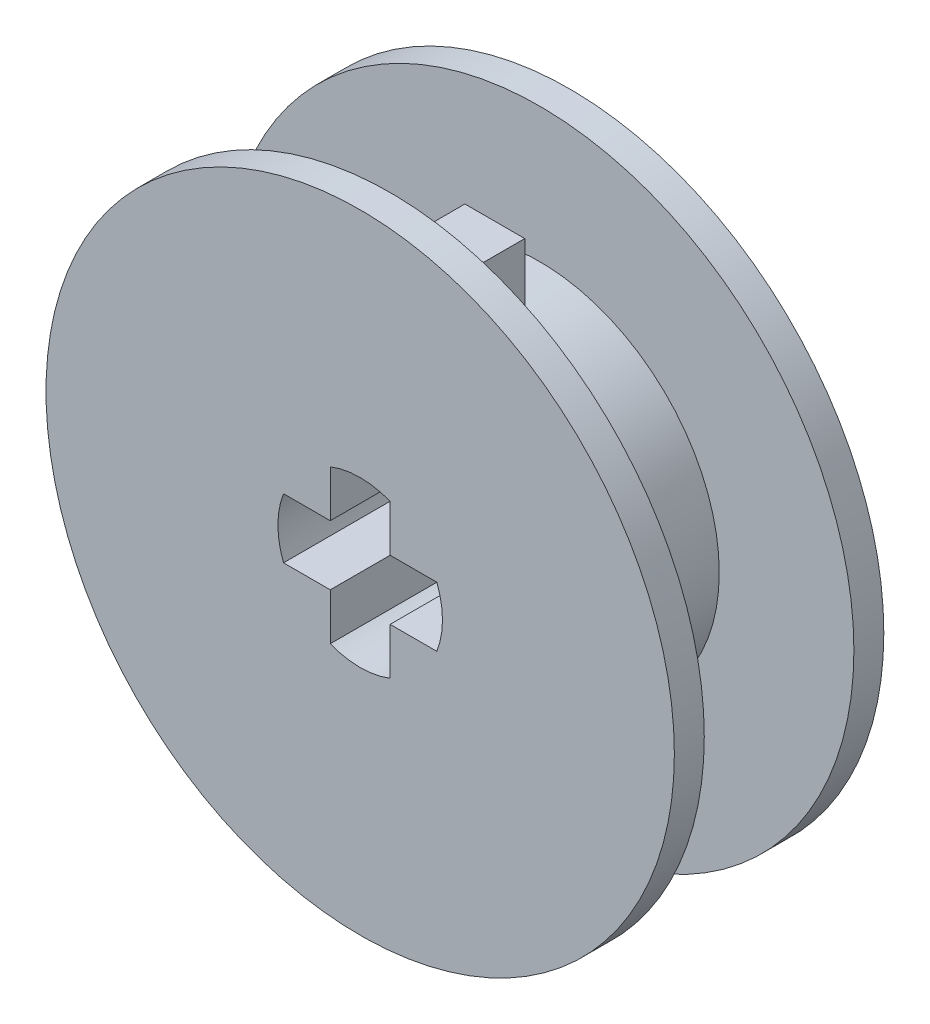
ISO-10303-21;
HEADER;
FILE_DESCRIPTION(('STEP AP214'),'2;1');
FILE_NAME('part.step','',(''),(''),'','','');
FILE_SCHEMA(('AUTOMOTIVE_DESIGN { 1 0 10303 214 1 1 1 1 }'));
ENDSEC;
DATA;
#1=APPLICATION_CONTEXT('core data for automotive mechanical design processes');
#2=APPLICATION_PROTOCOL_DEFINITION('international standard','automotive_design',2000,#1);
#3=PRODUCT_CONTEXT('',#1,'mechanical');
#4=PRODUCT('Part','Part','',(#3));
#5=PRODUCT_RELATED_PRODUCT_CATEGORY('part','',(#4));
#6=PRODUCT_DEFINITION_FORMATION('','',#4);
#7=PRODUCT_DEFINITION_CONTEXT('part definition',#1,'design');
#8=PRODUCT_DEFINITION('design','',#6,#7);
#9=PRODUCT_DEFINITION_SHAPE('','',#8);
#10=(LENGTH_UNIT() NAMED_UNIT(*) SI_UNIT(.MILLI.,.METRE.));
#11=(NAMED_UNIT(*) PLANE_ANGLE_UNIT() SI_UNIT($,.RADIAN.));
#12=(NAMED_UNIT(*) SI_UNIT($,.STERADIAN.) SOLID_ANGLE_UNIT());
#13=UNCERTAINTY_MEASURE_WITH_UNIT(LENGTH_MEASURE(1.E-05),#10,'distance_accuracy_value','');
#14=(GEOMETRIC_REPRESENTATION_CONTEXT(3) GLOBAL_UNCERTAINTY_ASSIGNED_CONTEXT((#13)) GLOBAL_UNIT_ASSIGNED_CONTEXT((#10,
#11,#12)) REPRESENTATION_CONTEXT('',''));
#15=CARTESIAN_POINT('',(0.,0.,0.));
#16=DIRECTION('',(0.,0.,1.));
#17=DIRECTION('',(1.,0.,0.));
#18=AXIS2_PLACEMENT_3D('',#15,#16,#17);
#19=CARTESIAN_POINT('',(0.,0.,2.5));
#20=DIRECTION('',(0.,0.,-1.));
#21=DIRECTION('',(-1.,0.,0.));
#22=AXIS2_PLACEMENT_3D('',#19,#20,#21);
#23=CYLINDRICAL_SURFACE('',#22,6.);
#24=CARTESIAN_POINT('',(0.,0.,2.5));
#25=DIRECTION('',(0.,0.,1.));
#26=DIRECTION('',(1.,0.,0.));
#27=AXIS2_PLACEMENT_3D('',#24,#25,#26);
#28=CIRCLE('',#27,6.);
#29=CARTESIAN_POINT('',(6.,0.,2.5));
#30=VERTEX_POINT('',#29);
#31=EDGE_CURVE('E42',#30,#30,#28,.T.);
#32=ORIENTED_EDGE('',*,*,#31,.F.);
#33=EDGE_LOOP('',(#32));
#34=FACE_BOUND('',#33,.T.);
#35=CARTESIAN_POINT('',(0.,0.,1.));
#36=DIRECTION('',(0.,0.,1.));
#37=DIRECTION('',(1.,0.,0.));
#38=AXIS2_PLACEMENT_3D('',#35,#36,#37);
#39=CIRCLE('',#38,6.);
#40=CARTESIAN_POINT('',(1.,5.91607978309962,1.));
#41=VERTEX_POINT('',#40);
#42=CARTESIAN_POINT('',(-0.999999999999999,5.91607978309962,1.));
#43=VERTEX_POINT('',#42);
#44=EDGE_CURVE('E11',#41,#43,#39,.T.);
#45=ORIENTED_EDGE('',*,*,#44,.T.);
#46=DIRECTION('',(0.,0.,-1.));
#47=VECTOR('',#46,1.);
#48=CARTESIAN_POINT('',(-0.999999999999999,5.91607978309962,1.));
#49=LINE('',#48,#47);
#50=CARTESIAN_POINT('',(-0.999999999999999,5.91607978309962,-1.));
#51=VERTEX_POINT('',#50);
#52=EDGE_CURVE('E155',#43,#51,#49,.T.);
#53=ORIENTED_EDGE('',*,*,#52,.T.);
#54=CARTESIAN_POINT('',(0.,0.,-1.));
#55=DIRECTION('',(0.,0.,1.));
#56=DIRECTION('',(1.,0.,0.));
#57=AXIS2_PLACEMENT_3D('',#54,#55,#56);
#58=CIRCLE('',#57,6.);
#59=CARTESIAN_POINT('',(1.,5.91607978309962,-1.));
#60=VERTEX_POINT('',#59);
#61=EDGE_CURVE('E163',#60,#51,#58,.T.);
#62=ORIENTED_EDGE('',*,*,#61,.F.);
#63=DIRECTION('',(0.,0.,-1.));
#64=VECTOR('',#63,1.);
#65=CARTESIAN_POINT('',(1.,5.91607978309962,1.));
#66=LINE('',#65,#64);
#67=EDGE_CURVE('E52',#41,#60,#66,.T.);
#68=ORIENTED_EDGE('',*,*,#67,.F.);
#69=EDGE_LOOP('',(#45,#53,#62,#68));
#70=FACE_BOUND('',#69,.T.);
#71=CARTESIAN_POINT('',(0.,0.,-2.5));
#72=DIRECTION('',(0.,0.,1.));
#73=DIRECTION('',(1.,0.,0.));
#74=AXIS2_PLACEMENT_3D('',#71,#72,#73);
#75=CIRCLE('',#74,6.);
#76=CARTESIAN_POINT('',(6.,0.,-2.5));
#77=VERTEX_POINT('',#76);
#78=EDGE_CURVE('E210',#77,#77,#75,.T.);
#79=ORIENTED_EDGE('',*,*,#78,.T.);
#80=EDGE_LOOP('',(#79));
#81=FACE_BOUND('',#80,.T.);
#82=ADVANCED_FACE('F35',(#34,#70,#81),#23,.T.);
#83=CARTESIAN_POINT('',(0.,0.,2.5));
#84=DIRECTION('',(0.,0.,-1.));
#85=DIRECTION('',(-1.,0.,0.));
#86=AXIS2_PLACEMENT_3D('',#83,#84,#85);
#87=CYLINDRICAL_SURFACE('',#86,2.75);
#88=DIRECTION('',(0.,0.,-1.));
#89=VECTOR('',#88,1.);
#90=CARTESIAN_POINT('',(2.5617376914899,1.,2.5));
#91=LINE('',#90,#89);
#92=CARTESIAN_POINT('',(2.5617376914899,1.,3.5));
#93=VERTEX_POINT('',#92);
#94=CARTESIAN_POINT('',(2.5617376914899,1.,-3.5));
#95=VERTEX_POINT('',#94);
#96=EDGE_CURVE('E289',#93,#95,#91,.T.);
#97=ORIENTED_EDGE('',*,*,#96,.T.);
#98=CARTESIAN_POINT('',(0.,0.,-3.5));
#99=DIRECTION('',(0.,0.,1.));
#100=DIRECTION('',(1.,0.,0.));
#101=AXIS2_PLACEMENT_3D('',#98,#99,#100);
#102=CIRCLE('',#101,2.75);
#103=CARTESIAN_POINT('',(2.5617376914899,-1.,-3.5));
#104=VERTEX_POINT('',#103);
#105=EDGE_CURVE('E197',#104,#95,#102,.T.);
#106=ORIENTED_EDGE('',*,*,#105,.F.);
#107=DIRECTION('',(0.,0.,-1.));
#108=VECTOR('',#107,1.);
#109=CARTESIAN_POINT('',(2.5617376914899,-1.,2.5));
#110=LINE('',#109,#108);
#111=CARTESIAN_POINT('',(2.5617376914899,-1.,3.5));
#112=VERTEX_POINT('',#111);
#113=EDGE_CURVE('E265',#112,#104,#110,.T.);
#114=ORIENTED_EDGE('',*,*,#113,.F.);
#115=CARTESIAN_POINT('',(0.,0.,3.5));
#116=DIRECTION('',(0.,0.,1.));
#117=DIRECTION('',(1.,0.,0.));
#118=AXIS2_PLACEMENT_3D('',#115,#116,#117);
#119=CIRCLE('',#118,2.75);
#120=EDGE_CURVE('E252',#112,#93,#119,.T.);
#121=ORIENTED_EDGE('',*,*,#120,.T.);
#122=EDGE_LOOP('',(#97,#106,#114,#121));
#123=FACE_BOUND('',#122,.T.);
#124=ADVANCED_FACE('F296',(#123),#87,.F.);
#125=CARTESIAN_POINT('',(1.,1.,2.5));
#126=DIRECTION('',(0.,-1.,0.));
#127=DIRECTION('',(1.,0.,0.));
#128=AXIS2_PLACEMENT_3D('',#125,#126,#127);
#129=PLANE('',#128);
#130=DIRECTION('',(0.,0.,-1.));
#131=VECTOR('',#130,1.);
#132=CARTESIAN_POINT('',(1.,1.,2.5));
#133=LINE('',#132,#131);
#134=CARTESIAN_POINT('',(1.,0.999999999999999,3.5));
#135=VERTEX_POINT('',#134);
#136=CARTESIAN_POINT('',(1.,0.999999999999999,-3.5));
#137=VERTEX_POINT('',#136);
#138=EDGE_CURVE('E287',#135,#137,#133,.T.);
#139=ORIENTED_EDGE('',*,*,#138,.T.);
#140=DIRECTION('',(-1.,0.,0.));
#141=VECTOR('',#140,1.);
#142=CARTESIAN_POINT('',(2.5617376914899,1.,-3.5));
#143=LINE('',#142,#141);
#144=EDGE_CURVE('E200',#95,#137,#143,.T.);
#145=ORIENTED_EDGE('',*,*,#144,.F.);
#146=ORIENTED_EDGE('',*,*,#96,.F.);
#147=DIRECTION('',(-1.,0.,0.));
#148=VECTOR('',#147,1.);
#149=CARTESIAN_POINT('',(2.5617376914899,1.,3.5));
#150=LINE('',#149,#148);
#151=EDGE_CURVE('E255',#93,#135,#150,.T.);
#152=ORIENTED_EDGE('',*,*,#151,.T.);
#153=EDGE_LOOP('',(#139,#145,#146,#152));
#154=FACE_BOUND('',#153,.T.);
#155=ADVANCED_FACE('F378',(#154),#129,.T.);
#156=CARTESIAN_POINT('',(1.,2.5617376914899,2.5));
#157=DIRECTION('',(-1.,0.,0.));
#158=DIRECTION('',(0.,-1.,0.));
#159=AXIS2_PLACEMENT_3D('',#156,#157,#158);
#160=PLANE('',#159);
#161=DIRECTION('',(0.,0.,-1.));
#162=VECTOR('',#161,1.);
#163=CARTESIAN_POINT('',(1.,2.5617376914899,2.5));
#164=LINE('',#163,#162);
#165=CARTESIAN_POINT('',(1.,2.5617376914899,3.5));
#166=VERTEX_POINT('',#165);
#167=CARTESIAN_POINT('',(1.,2.5617376914899,-3.5));
#168=VERTEX_POINT('',#167);
#169=EDGE_CURVE('E285',#166,#168,#164,.T.);
#170=ORIENTED_EDGE('',*,*,#169,.T.);
#171=DIRECTION('',(0.,1.,0.));
#172=VECTOR('',#171,1.);
#173=CARTESIAN_POINT('',(1.,0.999999999999999,-3.5));
#174=LINE('',#173,#172);
#175=EDGE_CURVE('E203',#137,#168,#174,.T.);
#176=ORIENTED_EDGE('',*,*,#175,.F.);
#177=ORIENTED_EDGE('',*,*,#138,.F.);
#178=DIRECTION('',(0.,1.,0.));
#179=VECTOR('',#178,1.);
#180=CARTESIAN_POINT('',(1.,0.999999999999999,3.5));
#181=LINE('',#180,#179);
#182=EDGE_CURVE('E258',#135,#166,#181,.T.);
#183=ORIENTED_EDGE('',*,*,#182,.T.);
#184=EDGE_LOOP('',(#170,#176,#177,#183));
#185=FACE_BOUND('',#184,.T.);
#186=ADVANCED_FACE('F374',(#185),#160,.T.);
#187=CARTESIAN_POINT('',(0.,0.,2.5));
#188=DIRECTION('',(0.,0.,-1.));
#189=DIRECTION('',(-1.,0.,0.));
#190=AXIS2_PLACEMENT_3D('',#187,#188,#189);
#191=CYLINDRICAL_SURFACE('',#190,2.75);
#192=DIRECTION('',(0.,0.,-1.));
#193=VECTOR('',#192,1.);
#194=CARTESIAN_POINT('',(-0.999999999999999,2.5617376914899,2.5));
#195=LINE('',#194,#193);
#196=CARTESIAN_POINT('',(-0.999999999999999,2.5617376914899,3.5));
#197=VERTEX_POINT('',#196);
#198=CARTESIAN_POINT('',(-0.999999999999999,2.5617376914899,-3.5));
#199=VERTEX_POINT('',#198);
#200=EDGE_CURVE('E283',#197,#199,#195,.T.);
#201=ORIENTED_EDGE('',*,*,#200,.T.);
#202=CARTESIAN_POINT('',(0.,0.,-3.5));
#203=DIRECTION('',(0.,0.,1.));
#204=DIRECTION('',(1.,0.,0.));
#205=AXIS2_PLACEMENT_3D('',#202,#203,#204);
#206=CIRCLE('',#205,2.75);
#207=EDGE_CURVE('E167',#168,#199,#206,.T.);
#208=ORIENTED_EDGE('',*,*,#207,.F.);
#209=ORIENTED_EDGE('',*,*,#169,.F.);
#210=CARTESIAN_POINT('',(0.,0.,3.5));
#211=DIRECTION('',(0.,0.,1.));
#212=DIRECTION('',(1.,0.,0.));
#213=AXIS2_PLACEMENT_3D('',#210,#211,#212);
#214=CIRCLE('',#213,2.75);
#215=EDGE_CURVE('E222',#166,#197,#214,.T.);
#216=ORIENTED_EDGE('',*,*,#215,.T.);
#217=EDGE_LOOP('',(#201,#208,#209,#216));
#218=FACE_BOUND('',#217,.T.);
#219=ADVANCED_FACE('F370',(#218),#191,.F.);
#220=CARTESIAN_POINT('',(-1.,2.5617376914899,2.5));
#221=DIRECTION('',(1.,0.,0.));
#222=DIRECTION('',(0.,1.,0.));
#223=AXIS2_PLACEMENT_3D('',#220,#221,#222);
#224=PLANE('',#223);
#225=DIRECTION('',(0.,0.,-1.));
#226=VECTOR('',#225,1.);
#227=CARTESIAN_POINT('',(-0.999999999999999,1.,2.5));
#228=LINE('',#227,#226);
#229=CARTESIAN_POINT('',(-0.999999999999999,1.,3.5));
#230=VERTEX_POINT('',#229);
#231=CARTESIAN_POINT('',(-0.999999999999999,1.,-3.5));
#232=VERTEX_POINT('',#231);
#233=EDGE_CURVE('E281',#230,#232,#228,.T.);
#234=ORIENTED_EDGE('',*,*,#233,.T.);
#235=DIRECTION('',(0.,-1.,0.));
#236=VECTOR('',#235,1.);
#237=CARTESIAN_POINT('',(-0.999999999999999,2.5617376914899,-3.5));
#238=LINE('',#237,#236);
#239=EDGE_CURVE('E170',#199,#232,#238,.T.);
#240=ORIENTED_EDGE('',*,*,#239,.F.);
#241=ORIENTED_EDGE('',*,*,#200,.F.);
#242=DIRECTION('',(0.,-1.,0.));
#243=VECTOR('',#242,1.);
#244=CARTESIAN_POINT('',(-0.999999999999999,2.5617376914899,3.5));
#245=LINE('',#244,#243);
#246=EDGE_CURVE('E228',#197,#230,#245,.T.);
#247=ORIENTED_EDGE('',*,*,#246,.T.);
#248=EDGE_LOOP('',(#234,#240,#241,#247));
#249=FACE_BOUND('',#248,.T.);
#250=ADVANCED_FACE('F366',(#249),#224,.T.);
#251=CARTESIAN_POINT('',(-2.5617376914899,1.,2.5));
#252=DIRECTION('',(0.,-1.,0.));
#253=DIRECTION('',(1.,0.,0.));
#254=AXIS2_PLACEMENT_3D('',#251,#252,#253);
#255=PLANE('',#254);
#256=DIRECTION('',(0.,0.,-1.));
#257=VECTOR('',#256,1.);
#258=CARTESIAN_POINT('',(-2.5617376914899,1.,2.5));
#259=LINE('',#258,#257);
#260=CARTESIAN_POINT('',(-2.5617376914899,1.,3.5));
#261=VERTEX_POINT('',#260);
#262=CARTESIAN_POINT('',(-2.5617376914899,1.,-3.5));
#263=VERTEX_POINT('',#262);
#264=EDGE_CURVE('E279',#261,#263,#259,.T.);
#265=ORIENTED_EDGE('',*,*,#264,.T.);
#266=DIRECTION('',(-1.,0.,0.));
#267=VECTOR('',#266,1.);
#268=CARTESIAN_POINT('',(-0.999999999999999,1.,-3.5));
#269=LINE('',#268,#267);
#270=EDGE_CURVE('E176',#232,#263,#269,.T.);
#271=ORIENTED_EDGE('',*,*,#270,.F.);
#272=ORIENTED_EDGE('',*,*,#233,.F.);
#273=DIRECTION('',(-1.,0.,0.));
#274=VECTOR('',#273,1.);
#275=CARTESIAN_POINT('',(-0.999999999999999,1.,3.5));
#276=LINE('',#275,#274);
#277=EDGE_CURVE('E231',#230,#261,#276,.T.);
#278=ORIENTED_EDGE('',*,*,#277,.T.);
#279=EDGE_LOOP('',(#265,#271,#272,#278));
#280=FACE_BOUND('',#279,.T.);
#281=ADVANCED_FACE('F362',(#280),#255,.T.);
#282=CARTESIAN_POINT('',(0.,0.,2.5));
#283=DIRECTION('',(0.,0.,-1.));
#284=DIRECTION('',(-1.,0.,0.));
#285=AXIS2_PLACEMENT_3D('',#282,#283,#284);
#286=CYLINDRICAL_SURFACE('',#285,2.75);
#287=DIRECTION('',(0.,0.,-1.));
#288=VECTOR('',#287,1.);
#289=CARTESIAN_POINT('',(-2.5617376914899,-1.,2.5));
#290=LINE('',#289,#288);
#291=CARTESIAN_POINT('',(-2.5617376914899,-1.,3.5));
#292=VERTEX_POINT('',#291);
#293=CARTESIAN_POINT('',(-2.5617376914899,-1.,-3.5));
#294=VERTEX_POINT('',#293);
#295=EDGE_CURVE('E277',#292,#294,#290,.T.);
#296=ORIENTED_EDGE('',*,*,#295,.T.);
#297=CARTESIAN_POINT('',(0.,0.,-3.5));
#298=DIRECTION('',(0.,0.,1.));
#299=DIRECTION('',(1.,0.,0.));
#300=AXIS2_PLACEMENT_3D('',#297,#298,#299);
#301=CIRCLE('',#300,2.75);
#302=EDGE_CURVE('E179',#263,#294,#301,.T.);
#303=ORIENTED_EDGE('',*,*,#302,.F.);
#304=ORIENTED_EDGE('',*,*,#264,.F.);
#305=CARTESIAN_POINT('',(0.,0.,3.5));
#306=DIRECTION('',(0.,0.,1.));
#307=DIRECTION('',(1.,0.,0.));
#308=AXIS2_PLACEMENT_3D('',#305,#306,#307);
#309=CIRCLE('',#308,2.75);
#310=EDGE_CURVE('E234',#261,#292,#309,.T.);
#311=ORIENTED_EDGE('',*,*,#310,.T.);
#312=EDGE_LOOP('',(#296,#303,#304,#311));
#313=FACE_BOUND('',#312,.T.);
#314=ADVANCED_FACE('F358',(#313),#286,.F.);
#315=CARTESIAN_POINT('',(-2.5617376914899,-1.,2.5));
#316=DIRECTION('',(0.,1.,0.));
#317=DIRECTION('',(-1.,0.,0.));
#318=AXIS2_PLACEMENT_3D('',#315,#316,#317);
#319=PLANE('',#318);
#320=DIRECTION('',(0.,0.,-1.));
#321=VECTOR('',#320,1.);
#322=CARTESIAN_POINT('',(-0.999999999999999,-1.,2.5));
#323=LINE('',#322,#321);
#324=CARTESIAN_POINT('',(-1.,-1.,3.5));
#325=VERTEX_POINT('',#324);
#326=CARTESIAN_POINT('',(-1.,-1.,-3.5));
#327=VERTEX_POINT('',#326);
#328=EDGE_CURVE('E275',#325,#327,#323,.T.);
#329=ORIENTED_EDGE('',*,*,#328,.T.);
#330=DIRECTION('',(1.,0.,0.));
#331=VECTOR('',#330,1.);
#332=CARTESIAN_POINT('',(-2.5617376914899,-1.,-3.5));
#333=LINE('',#332,#331);
#334=EDGE_CURVE('E182',#294,#327,#333,.T.);
#335=ORIENTED_EDGE('',*,*,#334,.F.);
#336=ORIENTED_EDGE('',*,*,#295,.F.);
#337=DIRECTION('',(1.,0.,0.));
#338=VECTOR('',#337,1.);
#339=CARTESIAN_POINT('',(-2.5617376914899,-1.,3.5));
#340=LINE('',#339,#338);
#341=EDGE_CURVE('E237',#292,#325,#340,.T.);
#342=ORIENTED_EDGE('',*,*,#341,.T.);
#343=EDGE_LOOP('',(#329,#335,#336,#342));
#344=FACE_BOUND('',#343,.T.);
#345=ADVANCED_FACE('F354',(#344),#319,.T.);
#346=CARTESIAN_POINT('',(-0.999999999999999,-1.,2.5));
#347=DIRECTION('',(1.,0.,0.));
#348=DIRECTION('',(0.,1.,0.));
#349=AXIS2_PLACEMENT_3D('',#346,#347,#348);
#350=PLANE('',#349);
#351=DIRECTION('',(0.,0.,-1.));
#352=VECTOR('',#351,1.);
#353=CARTESIAN_POINT('',(-1.,-2.5617376914899,2.5));
#354=LINE('',#353,#352);
#355=CARTESIAN_POINT('',(-0.999999999999999,-2.5617376914899,3.5));
#356=VERTEX_POINT('',#355);
#357=CARTESIAN_POINT('',(-0.999999999999999,-2.5617376914899,-3.5));
#358=VERTEX_POINT('',#357);
#359=EDGE_CURVE('E273',#356,#358,#354,.T.);
#360=ORIENTED_EDGE('',*,*,#359,.T.);
#361=DIRECTION('',(0.,-1.,0.));
#362=VECTOR('',#361,1.);
#363=CARTESIAN_POINT('',(-1.,-1.,-3.5));
#364=LINE('',#363,#362);
#365=EDGE_CURVE('E185',#327,#358,#364,.T.);
#366=ORIENTED_EDGE('',*,*,#365,.F.);
#367=ORIENTED_EDGE('',*,*,#328,.F.);
#368=DIRECTION('',(0.,-1.,0.));
#369=VECTOR('',#368,1.);
#370=CARTESIAN_POINT('',(-1.,-1.,3.5));
#371=LINE('',#370,#369);
#372=EDGE_CURVE('E240',#325,#356,#371,.T.);
#373=ORIENTED_EDGE('',*,*,#372,.T.);
#374=EDGE_LOOP('',(#360,#366,#367,#373));
#375=FACE_BOUND('',#374,.T.);
#376=ADVANCED_FACE('F350',(#375),#350,.T.);
#377=CARTESIAN_POINT('',(0.,0.,2.5));
#378=DIRECTION('',(0.,0.,-1.));
#379=DIRECTION('',(-1.,0.,0.));
#380=AXIS2_PLACEMENT_3D('',#377,#378,#379);
#381=CYLINDRICAL_SURFACE('',#380,2.75);
#382=DIRECTION('',(0.,0.,-1.));
#383=VECTOR('',#382,1.);
#384=CARTESIAN_POINT('',(1.,-2.5617376914899,2.5));
#385=LINE('',#384,#383);
#386=CARTESIAN_POINT('',(1.,-2.5617376914899,3.5));
#387=VERTEX_POINT('',#386);
#388=CARTESIAN_POINT('',(1.,-2.5617376914899,-3.5));
#389=VERTEX_POINT('',#388);
#390=EDGE_CURVE('E271',#387,#389,#385,.T.);
#391=ORIENTED_EDGE('',*,*,#390,.T.);
#392=CARTESIAN_POINT('',(0.,0.,-3.5));
#393=DIRECTION('',(0.,0.,1.));
#394=DIRECTION('',(1.,0.,0.));
#395=AXIS2_PLACEMENT_3D('',#392,#393,#394);
#396=CIRCLE('',#395,2.75);
#397=EDGE_CURVE('E188',#358,#389,#396,.T.);
#398=ORIENTED_EDGE('',*,*,#397,.F.);
#399=ORIENTED_EDGE('',*,*,#359,.F.);
#400=CARTESIAN_POINT('',(0.,0.,3.5));
#401=DIRECTION('',(0.,0.,1.));
#402=DIRECTION('',(1.,0.,0.));
#403=AXIS2_PLACEMENT_3D('',#400,#401,#402);
#404=CIRCLE('',#403,2.75);
#405=EDGE_CURVE('E243',#356,#387,#404,.T.);
#406=ORIENTED_EDGE('',*,*,#405,.T.);
#407=EDGE_LOOP('',(#391,#398,#399,#406));
#408=FACE_BOUND('',#407,.T.);
#409=ADVANCED_FACE('F346',(#408),#381,.F.);
#410=CARTESIAN_POINT('',(1.,-1.,2.5));
#411=DIRECTION('',(-1.,0.,0.));
#412=DIRECTION('',(0.,-1.,0.));
#413=AXIS2_PLACEMENT_3D('',#410,#411,#412);
#414=PLANE('',#413);
#415=DIRECTION('',(0.,0.,-1.));
#416=VECTOR('',#415,1.);
#417=CARTESIAN_POINT('',(1.,-1.,2.5));
#418=LINE('',#417,#416);
#419=CARTESIAN_POINT('',(1.,-1.,3.5));
#420=VERTEX_POINT('',#419);
#421=CARTESIAN_POINT('',(1.,-1.,-3.5));
#422=VERTEX_POINT('',#421);
#423=EDGE_CURVE('E269',#420,#422,#418,.T.);
#424=ORIENTED_EDGE('',*,*,#423,.T.);
#425=DIRECTION('',(0.,1.,0.));
#426=VECTOR('',#425,1.);
#427=CARTESIAN_POINT('',(1.,-2.5617376914899,-3.5));
#428=LINE('',#427,#426);
#429=EDGE_CURVE('E191',#389,#422,#428,.T.);
#430=ORIENTED_EDGE('',*,*,#429,.F.);
#431=ORIENTED_EDGE('',*,*,#390,.F.);
#432=DIRECTION('',(0.,1.,0.));
#433=VECTOR('',#432,1.);
#434=CARTESIAN_POINT('',(1.,-2.5617376914899,3.5));
#435=LINE('',#434,#433);
#436=EDGE_CURVE('E246',#387,#420,#435,.T.);
#437=ORIENTED_EDGE('',*,*,#436,.T.);
#438=EDGE_LOOP('',(#424,#430,#431,#437));
#439=FACE_BOUND('',#438,.T.);
#440=ADVANCED_FACE('F342',(#439),#414,.T.);
#441=CARTESIAN_POINT('',(1.,-1.,2.5));
#442=DIRECTION('',(0.,1.,0.));
#443=DIRECTION('',(-1.,0.,0.));
#444=AXIS2_PLACEMENT_3D('',#441,#442,#443);
#445=PLANE('',#444);
#446=ORIENTED_EDGE('',*,*,#113,.T.);
#447=DIRECTION('',(1.,0.,0.));
#448=VECTOR('',#447,1.);
#449=CARTESIAN_POINT('',(1.,-1.,-3.5));
#450=LINE('',#449,#448);
#451=EDGE_CURVE('E194',#422,#104,#450,.T.);
#452=ORIENTED_EDGE('',*,*,#451,.F.);
#453=ORIENTED_EDGE('',*,*,#423,.F.);
#454=DIRECTION('',(1.,0.,0.));
#455=VECTOR('',#454,1.);
#456=CARTESIAN_POINT('',(1.,-1.,3.5));
#457=LINE('',#456,#455);
#458=EDGE_CURVE('E249',#420,#112,#457,.T.);
#459=ORIENTED_EDGE('',*,*,#458,.T.);
#460=EDGE_LOOP('',(#446,#452,#453,#459));
#461=FACE_BOUND('',#460,.T.);
#462=ADVANCED_FACE('F335',(#461),#445,.T.);
#463=CARTESIAN_POINT('',(0.,0.,2.5));
#464=DIRECTION('',(0.,0.,1.));
#465=DIRECTION('',(1.,0.,0.));
#466=AXIS2_PLACEMENT_3D('',#463,#464,#465);
#467=PLANE('',#466);
#468=CARTESIAN_POINT('',(0.,0.,2.5));
#469=DIRECTION('',(0.,0.,1.));
#470=DIRECTION('',(1.,0.,0.));
#471=AXIS2_PLACEMENT_3D('',#468,#469,#470);
#472=CIRCLE('',#471,10.5);
#473=CARTESIAN_POINT('',(10.5,0.,2.5));
#474=VERTEX_POINT('',#473);
#475=EDGE_CURVE('E261',#474,#474,#472,.T.);
#476=ORIENTED_EDGE('',*,*,#475,.F.);
#477=EDGE_LOOP('',(#476));
#478=FACE_BOUND('',#477,.T.);
#479=ORIENTED_EDGE('',*,*,#31,.T.);
#480=EDGE_LOOP('',(#479));
#481=FACE_BOUND('',#480,.T.);
#482=ADVANCED_FACE('F293',(#478,#481),#467,.F.);
#483=CARTESIAN_POINT('',(0.,0.,3.5));
#484=DIRECTION('',(0.,0.,1.));
#485=DIRECTION('',(1.,0.,0.));
#486=AXIS2_PLACEMENT_3D('',#483,#484,#485);
#487=PLANE('',#486);
#488=CARTESIAN_POINT('',(0.,0.,3.5));
#489=DIRECTION('',(0.,0.,1.));
#490=DIRECTION('',(1.,0.,0.));
#491=AXIS2_PLACEMENT_3D('',#488,#489,#490);
#492=CIRCLE('',#491,10.5);
#493=CARTESIAN_POINT('',(10.5,0.,3.5));
#494=VERTEX_POINT('',#493);
#495=EDGE_CURVE('E262',#494,#494,#492,.T.);
#496=ORIENTED_EDGE('',*,*,#495,.T.);
#497=EDGE_LOOP('',(#496));
#498=FACE_BOUND('',#497,.T.);
#499=ORIENTED_EDGE('',*,*,#246,.F.);
#500=ORIENTED_EDGE('',*,*,#215,.F.);
#501=ORIENTED_EDGE('',*,*,#182,.F.);
#502=ORIENTED_EDGE('',*,*,#151,.F.);
#503=ORIENTED_EDGE('',*,*,#120,.F.);
#504=ORIENTED_EDGE('',*,*,#458,.F.);
#505=ORIENTED_EDGE('',*,*,#436,.F.);
#506=ORIENTED_EDGE('',*,*,#405,.F.);
#507=ORIENTED_EDGE('',*,*,#372,.F.);
#508=ORIENTED_EDGE('',*,*,#341,.F.);
#509=ORIENTED_EDGE('',*,*,#310,.F.);
#510=ORIENTED_EDGE('',*,*,#277,.F.);
#511=EDGE_LOOP('',(#499,#500,#501,#502,#503,#504,#505,#506,#507,#508,#509,#510));
#512=FACE_BOUND('',#511,.T.);
#513=ADVANCED_FACE('F329',(#498,#512),#487,.T.);
#514=CARTESIAN_POINT('',(0.,0.,3.5));
#515=DIRECTION('',(0.,0.,-1.));
#516=DIRECTION('',(-1.,0.,0.));
#517=AXIS2_PLACEMENT_3D('',#514,#515,#516);
#518=CYLINDRICAL_SURFACE('',#517,10.5);
#519=ORIENTED_EDGE('',*,*,#495,.F.);
#520=EDGE_LOOP('',(#519));
#521=FACE_BOUND('',#520,.T.);
#522=ORIENTED_EDGE('',*,*,#475,.T.);
#523=EDGE_LOOP('',(#522));
#524=FACE_BOUND('',#523,.T.);
#525=ADVANCED_FACE('F327',(#521,#524),#518,.T.);
#526=CARTESIAN_POINT('',(1.,5.91607978309962,1.));
#527=DIRECTION('',(1.,0.,0.));
#528=DIRECTION('',(0.,0.,-1.));
#529=AXIS2_PLACEMENT_3D('',#526,#527,#528);
#530=PLANE('',#529);
#531=ORIENTED_EDGE('',*,*,#67,.T.);
#532=DIRECTION('',(0.,-1.,0.));
#533=VECTOR('',#532,1.);
#534=CARTESIAN_POINT('',(1.,5.91607978309962,-1.));
#535=LINE('',#534,#533);
#536=CARTESIAN_POINT('',(1.,7.91607978309962,-1.));
#537=VERTEX_POINT('',#536);
#538=EDGE_CURVE('E164',#537,#60,#535,.T.);
#539=ORIENTED_EDGE('',*,*,#538,.F.);
#540=DIRECTION('',(0.,0.,-1.));
#541=VECTOR('',#540,1.);
#542=CARTESIAN_POINT('',(1.,7.91607978309962,1.));
#543=LINE('',#542,#541);
#544=CARTESIAN_POINT('',(1.,7.91607978309962,1.));
#545=VERTEX_POINT('',#544);
#546=EDGE_CURVE('E154',#545,#537,#543,.T.);
#547=ORIENTED_EDGE('',*,*,#546,.F.);
#548=DIRECTION('',(0.,-1.,0.));
#549=VECTOR('',#548,1.);
#550=CARTESIAN_POINT('',(1.,5.91607978309962,1.));
#551=LINE('',#550,#549);
#552=EDGE_CURVE('E216',#545,#41,#551,.T.);
#553=ORIENTED_EDGE('',*,*,#552,.T.);
#554=EDGE_LOOP('',(#531,#539,#547,#553));
#555=FACE_BOUND('',#554,.T.);
#556=ADVANCED_FACE('F322',(#555),#530,.T.);
#557=CARTESIAN_POINT('',(1.,7.91607978309962,1.));
#558=DIRECTION('',(0.,1.,0.));
#559=DIRECTION('',(0.,0.,1.));
#560=AXIS2_PLACEMENT_3D('',#557,#558,#559);
#561=PLANE('',#560);
#562=ORIENTED_EDGE('',*,*,#546,.T.);
#563=DIRECTION('',(1.,0.,0.));
#564=VECTOR('',#563,1.);
#565=CARTESIAN_POINT('',(1.,7.91607978309962,-1.));
#566=LINE('',#565,#564);
#567=CARTESIAN_POINT('',(-0.999999999999999,7.91607978309962,-1.));
#568=VERTEX_POINT('',#567);
#569=EDGE_CURVE('E161',#568,#537,#566,.T.);
#570=ORIENTED_EDGE('',*,*,#569,.F.);
#571=DIRECTION('',(0.,0.,-1.));
#572=VECTOR('',#571,1.);
#573=CARTESIAN_POINT('',(-0.999999999999999,7.91607978309962,1.));
#574=LINE('',#573,#572);
#575=CARTESIAN_POINT('',(-0.999999999999999,7.91607978309962,1.));
#576=VERTEX_POINT('',#575);
#577=EDGE_CURVE('E143',#576,#568,#574,.T.);
#578=ORIENTED_EDGE('',*,*,#577,.F.);
#579=DIRECTION('',(1.,0.,0.));
#580=VECTOR('',#579,1.);
#581=CARTESIAN_POINT('',(1.,7.91607978309962,1.));
#582=LINE('',#581,#580);
#583=EDGE_CURVE('E220',#576,#545,#582,.T.);
#584=ORIENTED_EDGE('',*,*,#583,.T.);
#585=EDGE_LOOP('',(#562,#570,#578,#584));
#586=FACE_BOUND('',#585,.T.);
#587=ADVANCED_FACE('F166',(#586),#561,.T.);
#588=CARTESIAN_POINT('',(-0.999999999999999,5.91607978309962,1.));
#589=DIRECTION('',(-1.,0.,0.));
#590=DIRECTION('',(0.,0.,1.));
#591=AXIS2_PLACEMENT_3D('',#588,#589,#590);
#592=PLANE('',#591);
#593=ORIENTED_EDGE('',*,*,#577,.T.);
#594=DIRECTION('',(0.,1.,0.));
#595=VECTOR('',#594,1.);
#596=CARTESIAN_POINT('',(-0.999999999999999,5.91607978309962,-1.));
#597=LINE('',#596,#595);
#598=EDGE_CURVE('E146',#51,#568,#597,.T.);
#599=ORIENTED_EDGE('',*,*,#598,.F.);
#600=ORIENTED_EDGE('',*,*,#52,.F.);
#601=DIRECTION('',(0.,1.,0.));
#602=VECTOR('',#601,1.);
#603=CARTESIAN_POINT('',(-0.999999999999999,5.91607978309962,1.));
#604=LINE('',#603,#602);
#605=EDGE_CURVE('E149',#43,#576,#604,.T.);
#606=ORIENTED_EDGE('',*,*,#605,.T.);
#607=EDGE_LOOP('',(#593,#599,#600,#606));
#608=FACE_BOUND('',#607,.T.);
#609=ADVANCED_FACE('F145',(#608),#592,.T.);
#610=CARTESIAN_POINT('',(0.,0.,1.));
#611=DIRECTION('',(0.,0.,1.));
#612=DIRECTION('',(1.,0.,0.));
#613=AXIS2_PLACEMENT_3D('',#610,#611,#612);
#614=PLANE('',#613);
#615=ORIENTED_EDGE('',*,*,#44,.F.);
#616=ORIENTED_EDGE('',*,*,#552,.F.);
#617=ORIENTED_EDGE('',*,*,#583,.F.);
#618=ORIENTED_EDGE('',*,*,#605,.F.);
#619=EDGE_LOOP('',(#615,#616,#617,#618));
#620=FACE_BOUND('',#619,.T.);
#621=ADVANCED_FACE('F303',(#620),#614,.T.);
#622=CARTESIAN_POINT('',(0.,0.,-2.5));
#623=DIRECTION('',(0.,0.,-1.));
#624=DIRECTION('',(1.,0.,0.));
#625=AXIS2_PLACEMENT_3D('',#622,#623,#624);
#626=PLANE('',#625);
#627=CARTESIAN_POINT('',(0.,0.,-2.5));
#628=DIRECTION('',(0.,0.,1.));
#629=DIRECTION('',(1.,0.,0.));
#630=AXIS2_PLACEMENT_3D('',#627,#628,#629);
#631=CIRCLE('',#630,10.5);
#632=CARTESIAN_POINT('',(10.5,0.,-2.5));
#633=VERTEX_POINT('',#632);
#634=EDGE_CURVE('E206',#633,#633,#631,.T.);
#635=ORIENTED_EDGE('',*,*,#634,.T.);
#636=EDGE_LOOP('',(#635));
#637=FACE_BOUND('',#636,.T.);
#638=ORIENTED_EDGE('',*,*,#78,.F.);
#639=EDGE_LOOP('',(#638));
#640=FACE_BOUND('',#639,.T.);
#641=ADVANCED_FACE('F300',(#637,#640),#626,.F.);
#642=CARTESIAN_POINT('',(0.,0.,-3.5));
#643=DIRECTION('',(0.,0.,-1.));
#644=DIRECTION('',(1.,0.,0.));
#645=AXIS2_PLACEMENT_3D('',#642,#643,#644);
#646=PLANE('',#645);
#647=CARTESIAN_POINT('',(0.,0.,-3.5));
#648=DIRECTION('',(0.,0.,1.));
#649=DIRECTION('',(1.,0.,0.));
#650=AXIS2_PLACEMENT_3D('',#647,#648,#649);
#651=CIRCLE('',#650,10.5);
#652=CARTESIAN_POINT('',(10.5,0.,-3.5));
#653=VERTEX_POINT('',#652);
#654=EDGE_CURVE('E207',#653,#653,#651,.T.);
#655=ORIENTED_EDGE('',*,*,#654,.F.);
#656=EDGE_LOOP('',(#655));
#657=FACE_BOUND('',#656,.T.);
#658=ORIENTED_EDGE('',*,*,#239,.T.);
#659=ORIENTED_EDGE('',*,*,#270,.T.);
#660=ORIENTED_EDGE('',*,*,#302,.T.);
#661=ORIENTED_EDGE('',*,*,#334,.T.);
#662=ORIENTED_EDGE('',*,*,#365,.T.);
#663=ORIENTED_EDGE('',*,*,#397,.T.);
#664=ORIENTED_EDGE('',*,*,#429,.T.);
#665=ORIENTED_EDGE('',*,*,#451,.T.);
#666=ORIENTED_EDGE('',*,*,#105,.T.);
#667=ORIENTED_EDGE('',*,*,#144,.T.);
#668=ORIENTED_EDGE('',*,*,#175,.T.);
#669=ORIENTED_EDGE('',*,*,#207,.T.);
#670=EDGE_LOOP('',(#658,#659,#660,#661,#662,#663,#664,#665,#666,#667,#668,#669));
#671=FACE_BOUND('',#670,.T.);
#672=ADVANCED_FACE('F302',(#657,#671),#646,.T.);
#673=CARTESIAN_POINT('',(0.,0.,-3.5));
#674=DIRECTION('',(0.,0.,1.));
#675=DIRECTION('',(-1.,0.,0.));
#676=AXIS2_PLACEMENT_3D('',#673,#674,#675);
#677=CYLINDRICAL_SURFACE('',#676,10.5);
#678=ORIENTED_EDGE('',*,*,#654,.T.);
#679=EDGE_LOOP('',(#678));
#680=FACE_BOUND('',#679,.T.);
#681=ORIENTED_EDGE('',*,*,#634,.F.);
#682=EDGE_LOOP('',(#681));
#683=FACE_BOUND('',#682,.T.);
#684=ADVANCED_FACE('F310',(#680,#683),#677,.T.);
#685=CARTESIAN_POINT('',(0.,0.,-1.));
#686=DIRECTION('',(0.,0.,-1.));
#687=DIRECTION('',(1.,0.,0.));
#688=AXIS2_PLACEMENT_3D('',#685,#686,#687);
#689=PLANE('',#688);
#690=ORIENTED_EDGE('',*,*,#61,.T.);
#691=ORIENTED_EDGE('',*,*,#598,.T.);
#692=ORIENTED_EDGE('',*,*,#569,.T.);
#693=ORIENTED_EDGE('',*,*,#538,.T.);
#694=EDGE_LOOP('',(#690,#691,#692,#693));
#695=FACE_BOUND('',#694,.T.);
#696=ADVANCED_FACE('F159',(#695),#689,.T.);
#697=CLOSED_SHELL('',(#82,#124,#155,#186,#219,#250,#281,#314,#345,#376,#409,#440,#462,#482,#513,
#525,#556,#587,#609,#621,#641,#672,#684,#696));
#698=MANIFOLD_SOLID_BREP('B2',#697);
#699=ADVANCED_BREP_SHAPE_REPRESENTATION('',(#18,#698),#14);
#700=SHAPE_DEFINITION_REPRESENTATION(#9,#699);
ENDSEC;
END-ISO-10303-21;
